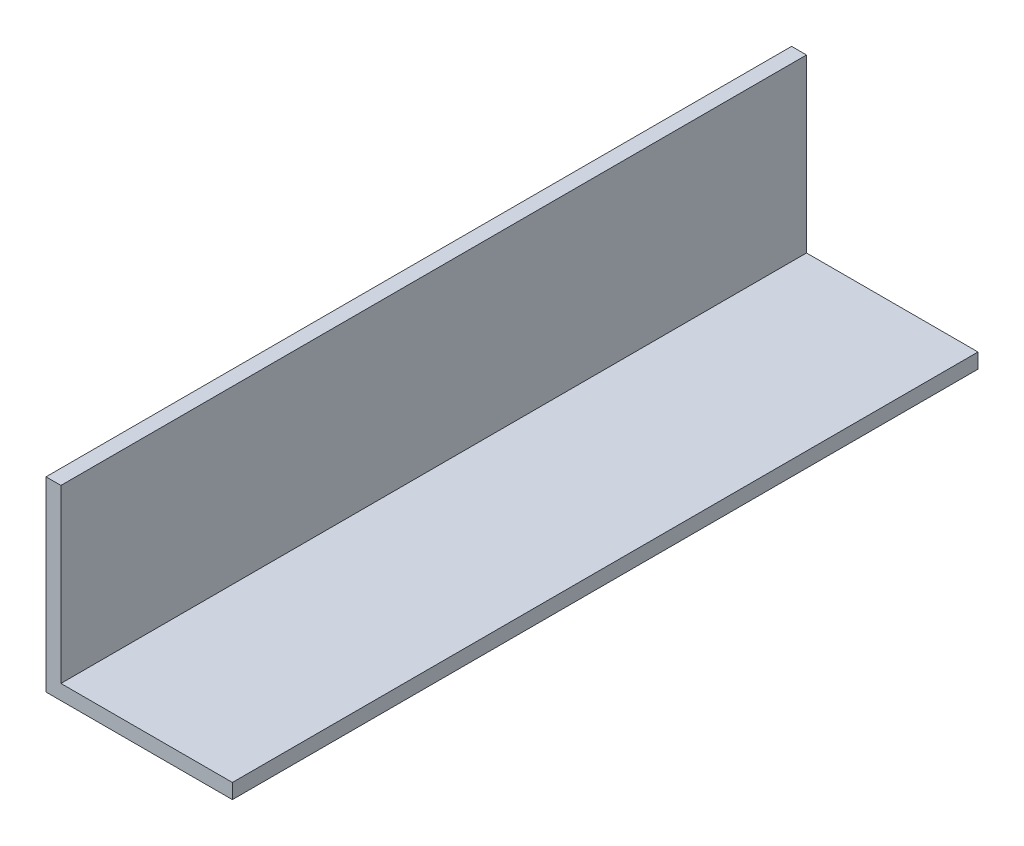
ISO-10303-21;
HEADER;
FILE_DESCRIPTION(('STEP AP214'),'2;1');
FILE_NAME('part.step','',(''),(''),'','','');
FILE_SCHEMA(('AUTOMOTIVE_DESIGN { 1 0 10303 214 1 1 1 1 }'));
ENDSEC;
DATA;
#1=APPLICATION_CONTEXT('core data for automotive mechanical design processes');
#2=APPLICATION_PROTOCOL_DEFINITION('international standard','automotive_design',2000,#1);
#3=PRODUCT_CONTEXT('',#1,'mechanical');
#4=PRODUCT('Part','Part','',(#3));
#5=PRODUCT_RELATED_PRODUCT_CATEGORY('part','',(#4));
#6=PRODUCT_DEFINITION_FORMATION('','',#4);
#7=PRODUCT_DEFINITION_CONTEXT('part definition',#1,'design');
#8=PRODUCT_DEFINITION('design','',#6,#7);
#9=PRODUCT_DEFINITION_SHAPE('','',#8);
#10=(LENGTH_UNIT() NAMED_UNIT(*) SI_UNIT(.MILLI.,.METRE.));
#11=(NAMED_UNIT(*) PLANE_ANGLE_UNIT() SI_UNIT($,.RADIAN.));
#12=(NAMED_UNIT(*) SI_UNIT($,.STERADIAN.) SOLID_ANGLE_UNIT());
#13=UNCERTAINTY_MEASURE_WITH_UNIT(LENGTH_MEASURE(1.E-05),#10,'distance_accuracy_value','');
#14=(GEOMETRIC_REPRESENTATION_CONTEXT(3) GLOBAL_UNCERTAINTY_ASSIGNED_CONTEXT((#13)) GLOBAL_UNIT_ASSIGNED_CONTEXT((#10,
#11,#12)) REPRESENTATION_CONTEXT('',''));
#15=CARTESIAN_POINT('',(0.,0.,0.));
#16=DIRECTION('',(0.,0.,1.));
#17=DIRECTION('',(1.,0.,0.));
#18=AXIS2_PLACEMENT_3D('',#15,#16,#17);
#19=CARTESIAN_POINT('',(0.,25.,100.));
#20=DIRECTION('',(1.,0.,0.));
#21=DIRECTION('',(0.,0.,-1.));
#22=AXIS2_PLACEMENT_3D('',#19,#20,#21);
#23=PLANE('',#22);
#24=DIRECTION('',(0.,-1.,0.));
#25=VECTOR('',#24,1.);
#26=CARTESIAN_POINT('',(0.,25.,0.));
#27=LINE('',#26,#25);
#28=CARTESIAN_POINT('',(0.,25.,0.));
#29=VERTEX_POINT('',#28);
#30=CARTESIAN_POINT('',(0.,0.,0.));
#31=VERTEX_POINT('',#30);
#32=EDGE_CURVE('E128',#29,#31,#27,.T.);
#33=ORIENTED_EDGE('',*,*,#32,.T.);
#34=DIRECTION('',(0.,0.,-1.));
#35=VECTOR('',#34,1.);
#36=CARTESIAN_POINT('',(0.,0.,100.));
#37=LINE('',#36,#35);
#38=CARTESIAN_POINT('',(0.,0.,100.));
#39=VERTEX_POINT('',#38);
#40=EDGE_CURVE('E11',#39,#31,#37,.T.);
#41=ORIENTED_EDGE('',*,*,#40,.F.);
#42=DIRECTION('',(0.,-1.,0.));
#43=VECTOR('',#42,1.);
#44=CARTESIAN_POINT('',(0.,25.,100.));
#45=LINE('',#44,#43);
#46=CARTESIAN_POINT('',(0.,25.,100.));
#47=VERTEX_POINT('',#46);
#48=EDGE_CURVE('E144',#47,#39,#45,.T.);
#49=ORIENTED_EDGE('',*,*,#48,.F.);
#50=DIRECTION('',(0.,0.,-1.));
#51=VECTOR('',#50,1.);
#52=CARTESIAN_POINT('',(0.,25.,100.));
#53=LINE('',#52,#51);
#54=EDGE_CURVE('E124',#47,#29,#53,.T.);
#55=ORIENTED_EDGE('',*,*,#54,.T.);
#56=EDGE_LOOP('',(#33,#41,#49,#55));
#57=FACE_BOUND('',#56,.T.);
#58=ADVANCED_FACE('F39',(#57),#23,.F.);
#59=CARTESIAN_POINT('',(0.,0.,100.));
#60=DIRECTION('',(0.,1.,0.));
#61=DIRECTION('',(0.,0.,1.));
#62=AXIS2_PLACEMENT_3D('',#59,#60,#61);
#63=PLANE('',#62);
#64=DIRECTION('',(1.,0.,0.));
#65=VECTOR('',#64,1.);
#66=CARTESIAN_POINT('',(0.,0.,0.));
#67=LINE('',#66,#65);
#68=CARTESIAN_POINT('',(25.,0.,0.));
#69=VERTEX_POINT('',#68);
#70=EDGE_CURVE('E132',#31,#69,#67,.T.);
#71=ORIENTED_EDGE('',*,*,#70,.T.);
#72=DIRECTION('',(0.,0.,-1.));
#73=VECTOR('',#72,1.);
#74=CARTESIAN_POINT('',(25.,0.,100.));
#75=LINE('',#74,#73);
#76=CARTESIAN_POINT('',(25.,0.,100.));
#77=VERTEX_POINT('',#76);
#78=EDGE_CURVE('E48',#77,#69,#75,.T.);
#79=ORIENTED_EDGE('',*,*,#78,.F.);
#80=DIRECTION('',(1.,0.,0.));
#81=VECTOR('',#80,1.);
#82=CARTESIAN_POINT('',(0.,0.,100.));
#83=LINE('',#82,#81);
#84=EDGE_CURVE('E93',#39,#77,#83,.T.);
#85=ORIENTED_EDGE('',*,*,#84,.F.);
#86=ORIENTED_EDGE('',*,*,#40,.T.);
#87=EDGE_LOOP('',(#71,#79,#85,#86));
#88=FACE_BOUND('',#87,.T.);
#89=ADVANCED_FACE('F172',(#88),#63,.F.);
#90=CARTESIAN_POINT('',(25.,0.,100.));
#91=DIRECTION('',(-1.,0.,0.));
#92=DIRECTION('',(0.,0.,1.));
#93=AXIS2_PLACEMENT_3D('',#90,#91,#92);
#94=PLANE('',#93);
#95=DIRECTION('',(0.,1.,0.));
#96=VECTOR('',#95,1.);
#97=CARTESIAN_POINT('',(25.,0.,0.));
#98=LINE('',#97,#96);
#99=CARTESIAN_POINT('',(25.,2.,0.));
#100=VERTEX_POINT('',#99);
#101=EDGE_CURVE('E135',#69,#100,#98,.T.);
#102=ORIENTED_EDGE('',*,*,#101,.T.);
#103=DIRECTION('',(0.,0.,-1.));
#104=VECTOR('',#103,1.);
#105=CARTESIAN_POINT('',(25.,2.,100.));
#106=LINE('',#105,#104);
#107=CARTESIAN_POINT('',(25.,2.,100.));
#108=VERTEX_POINT('',#107);
#109=EDGE_CURVE('E117',#108,#100,#106,.T.);
#110=ORIENTED_EDGE('',*,*,#109,.F.);
#111=DIRECTION('',(0.,1.,0.));
#112=VECTOR('',#111,1.);
#113=CARTESIAN_POINT('',(25.,0.,100.));
#114=LINE('',#113,#112);
#115=EDGE_CURVE('E106',#77,#108,#114,.T.);
#116=ORIENTED_EDGE('',*,*,#115,.F.);
#117=ORIENTED_EDGE('',*,*,#78,.T.);
#118=EDGE_LOOP('',(#102,#110,#116,#117));
#119=FACE_BOUND('',#118,.T.);
#120=ADVANCED_FACE('F154',(#119),#94,.F.);
#121=CARTESIAN_POINT('',(25.,2.,100.));
#122=DIRECTION('',(0.,-1.,0.));
#123=DIRECTION('',(1.,0.,0.));
#124=AXIS2_PLACEMENT_3D('',#121,#122,#123);
#125=PLANE('',#124);
#126=DIRECTION('',(-1.,0.,0.));
#127=VECTOR('',#126,1.);
#128=CARTESIAN_POINT('',(25.,2.,0.));
#129=LINE('',#128,#127);
#130=CARTESIAN_POINT('',(2.,2.,0.));
#131=VERTEX_POINT('',#130);
#132=EDGE_CURVE('E115',#100,#131,#129,.T.);
#133=ORIENTED_EDGE('',*,*,#132,.T.);
#134=DIRECTION('',(0.,0.,-1.));
#135=VECTOR('',#134,1.);
#136=CARTESIAN_POINT('',(2.,2.,100.));
#137=LINE('',#136,#135);
#138=CARTESIAN_POINT('',(2.,2.,100.));
#139=VERTEX_POINT('',#138);
#140=EDGE_CURVE('E112',#139,#131,#137,.T.);
#141=ORIENTED_EDGE('',*,*,#140,.F.);
#142=DIRECTION('',(-1.,0.,0.));
#143=VECTOR('',#142,1.);
#144=CARTESIAN_POINT('',(25.,2.,100.));
#145=LINE('',#144,#143);
#146=EDGE_CURVE('E100',#108,#139,#145,.T.);
#147=ORIENTED_EDGE('',*,*,#146,.F.);
#148=ORIENTED_EDGE('',*,*,#109,.T.);
#149=EDGE_LOOP('',(#133,#141,#147,#148));
#150=FACE_BOUND('',#149,.T.);
#151=ADVANCED_FACE('F113',(#150),#125,.F.);
#152=CARTESIAN_POINT('',(2.,2.,100.));
#153=DIRECTION('',(-1.,0.,0.));
#154=DIRECTION('',(0.,-1.,0.));
#155=AXIS2_PLACEMENT_3D('',#152,#153,#154);
#156=PLANE('',#155);
#157=DIRECTION('',(0.,1.,0.));
#158=VECTOR('',#157,1.);
#159=CARTESIAN_POINT('',(2.,2.,0.));
#160=LINE('',#159,#158);
#161=CARTESIAN_POINT('',(2.,25.,0.));
#162=VERTEX_POINT('',#161);
#163=EDGE_CURVE('E79',#131,#162,#160,.T.);
#164=ORIENTED_EDGE('',*,*,#163,.T.);
#165=DIRECTION('',(0.,0.,-1.));
#166=VECTOR('',#165,1.);
#167=CARTESIAN_POINT('',(2.,25.,100.));
#168=LINE('',#167,#166);
#169=CARTESIAN_POINT('',(2.,25.,100.));
#170=VERTEX_POINT('',#169);
#171=EDGE_CURVE('E118',#170,#162,#168,.T.);
#172=ORIENTED_EDGE('',*,*,#171,.F.);
#173=DIRECTION('',(0.,1.,0.));
#174=VECTOR('',#173,1.);
#175=CARTESIAN_POINT('',(2.,2.,100.));
#176=LINE('',#175,#174);
#177=EDGE_CURVE('E104',#139,#170,#176,.T.);
#178=ORIENTED_EDGE('',*,*,#177,.F.);
#179=ORIENTED_EDGE('',*,*,#140,.T.);
#180=EDGE_LOOP('',(#164,#172,#178,#179));
#181=FACE_BOUND('',#180,.T.);
#182=ADVANCED_FACE('F120',(#181),#156,.F.);
#183=CARTESIAN_POINT('',(2.,25.,100.));
#184=DIRECTION('',(0.,-1.,0.));
#185=DIRECTION('',(0.,0.,-1.));
#186=AXIS2_PLACEMENT_3D('',#183,#184,#185);
#187=PLANE('',#186);
#188=DIRECTION('',(-1.,0.,0.));
#189=VECTOR('',#188,1.);
#190=CARTESIAN_POINT('',(2.,25.,0.));
#191=LINE('',#190,#189);
#192=EDGE_CURVE('E85',#162,#29,#191,.T.);
#193=ORIENTED_EDGE('',*,*,#192,.T.);
#194=ORIENTED_EDGE('',*,*,#54,.F.);
#195=DIRECTION('',(-1.,0.,0.));
#196=VECTOR('',#195,1.);
#197=CARTESIAN_POINT('',(2.,25.,100.));
#198=LINE('',#197,#196);
#199=EDGE_CURVE('E56',#170,#47,#198,.T.);
#200=ORIENTED_EDGE('',*,*,#199,.F.);
#201=ORIENTED_EDGE('',*,*,#171,.T.);
#202=EDGE_LOOP('',(#193,#194,#200,#201));
#203=FACE_BOUND('',#202,.T.);
#204=ADVANCED_FACE('F161',(#203),#187,.F.);
#205=CARTESIAN_POINT('',(0.,0.,100.));
#206=DIRECTION('',(0.,0.,1.));
#207=DIRECTION('',(1.,0.,0.));
#208=AXIS2_PLACEMENT_3D('',#205,#206,#207);
#209=PLANE('',#208);
#210=ORIENTED_EDGE('',*,*,#48,.T.);
#211=ORIENTED_EDGE('',*,*,#84,.T.);
#212=ORIENTED_EDGE('',*,*,#115,.T.);
#213=ORIENTED_EDGE('',*,*,#146,.T.);
#214=ORIENTED_EDGE('',*,*,#177,.T.);
#215=ORIENTED_EDGE('',*,*,#199,.T.);
#216=EDGE_LOOP('',(#210,#211,#212,#213,#214,#215));
#217=FACE_BOUND('',#216,.T.);
#218=ADVANCED_FACE('F102',(#217),#209,.T.);
#219=CARTESIAN_POINT('',(0.,0.,0.));
#220=DIRECTION('',(0.,0.,1.));
#221=DIRECTION('',(1.,0.,0.));
#222=AXIS2_PLACEMENT_3D('',#219,#220,#221);
#223=PLANE('',#222);
#224=ORIENTED_EDGE('',*,*,#32,.F.);
#225=ORIENTED_EDGE('',*,*,#192,.F.);
#226=ORIENTED_EDGE('',*,*,#163,.F.);
#227=ORIENTED_EDGE('',*,*,#132,.F.);
#228=ORIENTED_EDGE('',*,*,#101,.F.);
#229=ORIENTED_EDGE('',*,*,#70,.F.);
#230=EDGE_LOOP('',(#224,#225,#226,#227,#228,#229));
#231=FACE_BOUND('',#230,.T.);
#232=ADVANCED_FACE('F157',(#231),#223,.F.);
#233=CLOSED_SHELL('',(#58,#89,#120,#151,#182,#204,#218,#232));
#234=MANIFOLD_SOLID_BREP('B2',#233);
#235=ADVANCED_BREP_SHAPE_REPRESENTATION('',(#18,#234),#14);
#236=SHAPE_DEFINITION_REPRESENTATION(#9,#235);
ENDSEC;
END-ISO-10303-21;
